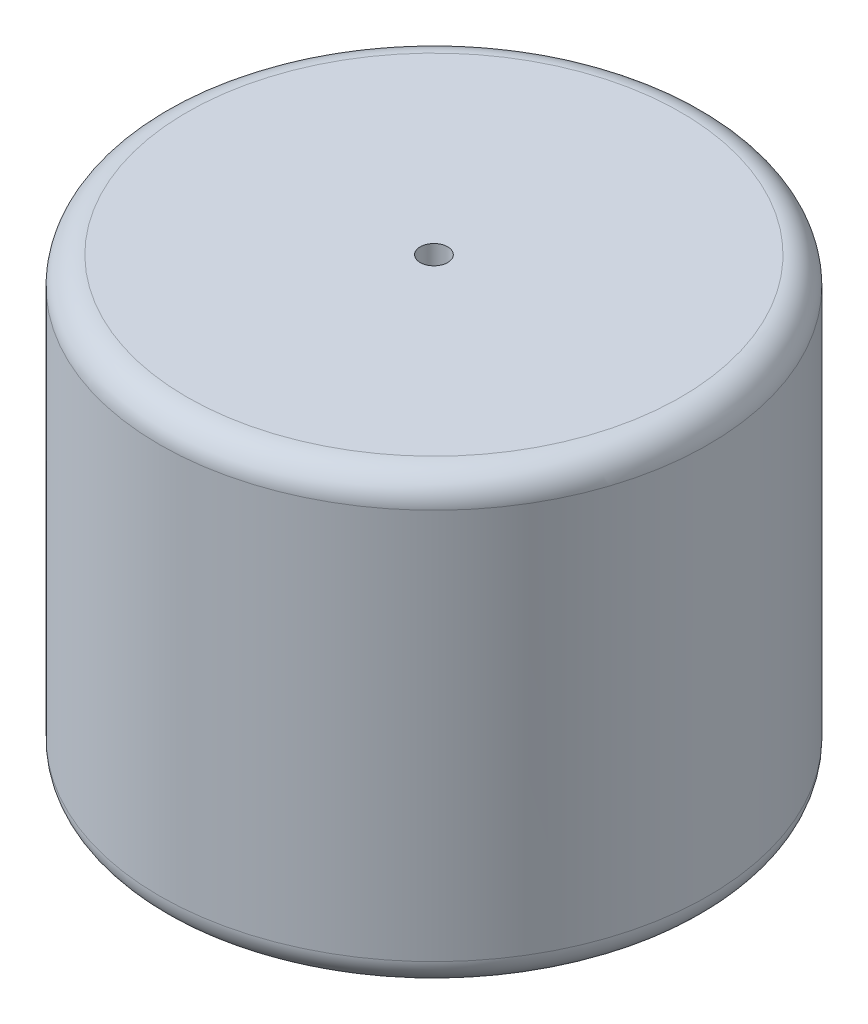
ISO-10303-21;
HEADER;
FILE_DESCRIPTION(('STEP AP214'),'2;1');
FILE_NAME('part.step','',(''),(''),'','','');
FILE_SCHEMA(('AUTOMOTIVE_DESIGN { 1 0 10303 214 1 1 1 1 }'));
ENDSEC;
DATA;
#1=APPLICATION_CONTEXT('core data for automotive mechanical design processes');
#2=APPLICATION_PROTOCOL_DEFINITION('international standard','automotive_design',2000,#1);
#3=PRODUCT_CONTEXT('',#1,'mechanical');
#4=PRODUCT('Part','Part','',(#3));
#5=PRODUCT_RELATED_PRODUCT_CATEGORY('part','',(#4));
#6=PRODUCT_DEFINITION_FORMATION('','',#4);
#7=PRODUCT_DEFINITION_CONTEXT('part definition',#1,'design');
#8=PRODUCT_DEFINITION('design','',#6,#7);
#9=PRODUCT_DEFINITION_SHAPE('','',#8);
#10=(LENGTH_UNIT() NAMED_UNIT(*) SI_UNIT(.MILLI.,.METRE.));
#11=(NAMED_UNIT(*) PLANE_ANGLE_UNIT() SI_UNIT($,.RADIAN.));
#12=(NAMED_UNIT(*) SI_UNIT($,.STERADIAN.) SOLID_ANGLE_UNIT());
#13=UNCERTAINTY_MEASURE_WITH_UNIT(LENGTH_MEASURE(1.E-05),#10,'distance_accuracy_value','');
#14=(GEOMETRIC_REPRESENTATION_CONTEXT(3) GLOBAL_UNCERTAINTY_ASSIGNED_CONTEXT((#13)) GLOBAL_UNIT_ASSIGNED_CONTEXT((#10,
#11,#12)) REPRESENTATION_CONTEXT('',''));
#15=CARTESIAN_POINT('',(0.,0.,0.));
#16=DIRECTION('',(0.,0.,1.));
#17=DIRECTION('',(1.,0.,0.));
#18=AXIS2_PLACEMENT_3D('',#15,#16,#17);
#19=CARTESIAN_POINT('',(0.,-7.5,0.));
#20=DIRECTION('',(0.,1.,0.));
#21=DIRECTION('',(0.,0.,1.));
#22=AXIS2_PLACEMENT_3D('',#19,#20,#21);
#23=PLANE('',#22);
#24=CARTESIAN_POINT('',(0.,-7.5,0.));
#25=DIRECTION('',(0.,1.,0.));
#26=DIRECTION('',(0.,0.,1.));
#27=AXIS2_PLACEMENT_3D('',#24,#25,#26);
#28=CIRCLE('',#27,3.6);
#29=CARTESIAN_POINT('',(0.,-7.5,3.6));
#30=VERTEX_POINT('',#29);
#31=EDGE_CURVE('E209',#30,#30,#28,.T.);
#32=ORIENTED_EDGE('',*,*,#31,.T.);
#33=EDGE_LOOP('',(#32));
#34=FACE_BOUND('',#33,.T.);
#35=CARTESIAN_POINT('',(0.,-7.5,0.));
#36=DIRECTION('',(0.,-1.,0.));
#37=DIRECTION('',(0.,0.,-1.));
#38=AXIS2_PLACEMENT_3D('',#35,#36,#37);
#39=CIRCLE('',#38,12.5);
#40=CARTESIAN_POINT('',(0.,-7.5,-12.5));
#41=VERTEX_POINT('',#40);
#42=CARTESIAN_POINT('',(0.,-7.5,12.5));
#43=VERTEX_POINT('',#42);
#44=EDGE_CURVE('E187',#41,#43,#39,.T.);
#45=ORIENTED_EDGE('',*,*,#44,.T.);
#46=DIRECTION('',(1.,0.,0.));
#47=VECTOR('',#46,1.);
#48=CARTESIAN_POINT('',(-20.,-7.5,12.5));
#49=LINE('',#48,#47);
#50=CARTESIAN_POINT('',(-15.612494995996,-7.5,12.5));
#51=VERTEX_POINT('',#50);
#52=EDGE_CURVE('E315',#51,#43,#49,.T.);
#53=ORIENTED_EDGE('',*,*,#52,.F.);
#54=CARTESIAN_POINT('',(0.,-7.5,0.));
#55=DIRECTION('',(0.,1.,0.));
#56=DIRECTION('',(0.,0.,1.));
#57=AXIS2_PLACEMENT_3D('',#54,#55,#56);
#58=CIRCLE('',#57,20.);
#59=CARTESIAN_POINT('',(-15.612494995996,-7.5,-12.5));
#60=VERTEX_POINT('',#59);
#61=EDGE_CURVE('E359',#51,#60,#58,.F.);
#62=ORIENTED_EDGE('',*,*,#61,.T.);
#63=DIRECTION('',(1.,0.,0.));
#64=VECTOR('',#63,1.);
#65=CARTESIAN_POINT('',(-20.,-7.5,-12.5));
#66=LINE('',#65,#64);
#67=EDGE_CURVE('E318',#60,#41,#66,.T.);
#68=ORIENTED_EDGE('',*,*,#67,.T.);
#69=EDGE_LOOP('',(#45,#53,#62,#68));
#70=FACE_BOUND('',#69,.T.);
#71=ADVANCED_FACE('F38',(#34,#70),#23,.F.);
#72=CARTESIAN_POINT('',(0.,-22.5,0.));
#73=DIRECTION('',(0.,1.,0.));
#74=DIRECTION('',(0.,0.,1.));
#75=AXIS2_PLACEMENT_3D('',#72,#73,#74);
#76=CYLINDRICAL_SURFACE('',#75,12.5);
#77=DIRECTION('',(0.,1.,0.));
#78=VECTOR('',#77,1.);
#79=CARTESIAN_POINT('',(-10.,-22.5,-7.5));
#80=LINE('',#79,#78);
#81=CARTESIAN_POINT('',(-10.,-22.5,-7.5));
#82=VERTEX_POINT('',#81);
#83=CARTESIAN_POINT('',(-10.,-17.5,-7.5));
#84=VERTEX_POINT('',#83);
#85=EDGE_CURVE('E347',#82,#84,#80,.T.);
#86=ORIENTED_EDGE('',*,*,#85,.F.);
#87=CARTESIAN_POINT('',(0.,-22.5,0.));
#88=DIRECTION('',(0.,-1.,0.));
#89=DIRECTION('',(0.,0.,-1.));
#90=AXIS2_PLACEMENT_3D('',#87,#88,#89);
#91=CIRCLE('',#90,12.5);
#92=CARTESIAN_POINT('',(-10.,-22.5,7.5));
#93=VERTEX_POINT('',#92);
#94=EDGE_CURVE('E194',#82,#93,#91,.T.);
#95=ORIENTED_EDGE('',*,*,#94,.T.);
#96=DIRECTION('',(0.,1.,0.));
#97=VECTOR('',#96,1.);
#98=CARTESIAN_POINT('',(-10.,-22.5,7.5));
#99=LINE('',#98,#97);
#100=CARTESIAN_POINT('',(-10.,-17.5,7.5));
#101=VERTEX_POINT('',#100);
#102=EDGE_CURVE('E334',#101,#93,#99,.F.);
#103=ORIENTED_EDGE('',*,*,#102,.F.);
#104=CARTESIAN_POINT('',(0.,-17.5,0.));
#105=DIRECTION('',(0.,-1.,0.));
#106=DIRECTION('',(0.,0.,-1.));
#107=AXIS2_PLACEMENT_3D('',#104,#105,#106);
#108=CIRCLE('',#107,12.5);
#109=CARTESIAN_POINT('',(0.,-17.5,12.5));
#110=VERTEX_POINT('',#109);
#111=EDGE_CURVE('E191',#110,#101,#108,.T.);
#112=ORIENTED_EDGE('',*,*,#111,.F.);
#113=DIRECTION('',(0.,-1.,0.));
#114=VECTOR('',#113,1.);
#115=CARTESIAN_POINT('',(0.,-7.5,12.5));
#116=LINE('',#115,#114);
#117=EDGE_CURVE('E297',#43,#110,#116,.T.);
#118=ORIENTED_EDGE('',*,*,#117,.F.);
#119=ORIENTED_EDGE('',*,*,#44,.F.);
#120=DIRECTION('',(0.,1.,0.));
#121=VECTOR('',#120,1.);
#122=CARTESIAN_POINT('',(0.,-7.5,-12.5));
#123=LINE('',#122,#121);
#124=CARTESIAN_POINT('',(0.,-17.5,-12.5));
#125=VERTEX_POINT('',#124);
#126=EDGE_CURVE('E293',#125,#41,#123,.T.);
#127=ORIENTED_EDGE('',*,*,#126,.F.);
#128=CARTESIAN_POINT('',(0.,-17.5,0.));
#129=DIRECTION('',(0.,-1.,0.));
#130=DIRECTION('',(0.,0.,-1.));
#131=AXIS2_PLACEMENT_3D('',#128,#129,#130);
#132=CIRCLE('',#131,12.5);
#133=EDGE_CURVE('E200',#84,#125,#132,.T.);
#134=ORIENTED_EDGE('',*,*,#133,.F.);
#135=EDGE_LOOP('',(#86,#95,#103,#112,#118,#119,#127,#134));
#136=FACE_BOUND('',#135,.T.);
#137=ADVANCED_FACE('F420',(#136),#76,.F.);
#138=CARTESIAN_POINT('',(0.,-22.5,0.));
#139=DIRECTION('',(0.,-1.,0.));
#140=DIRECTION('',(0.,0.,-1.));
#141=AXIS2_PLACEMENT_3D('',#138,#139,#140);
#142=PLANE('',#141);
#143=ORIENTED_EDGE('',*,*,#94,.F.);
#144=DIRECTION('',(1.,0.,0.));
#145=VECTOR('',#144,1.);
#146=CARTESIAN_POINT('',(0.,-22.5,-7.5));
#147=LINE('',#146,#145);
#148=CARTESIAN_POINT('',(-6.88856760882264,-22.5,-7.5));
#149=VERTEX_POINT('',#148);
#150=EDGE_CURVE('E343',#82,#149,#147,.T.);
#151=ORIENTED_EDGE('',*,*,#150,.T.);
#152=DIRECTION('',(0.851038037822176,0.,-0.525104045099427));
#153=VECTOR('',#152,1.);
#154=CARTESIAN_POINT('',(-10.1645108532667,-22.5,-5.47869076031458));
#155=LINE('',#154,#153);
#156=CARTESIAN_POINT('',(-0.337570048721829,-22.5,-11.5420699961289));
#157=VERTEX_POINT('',#156);
#158=EDGE_CURVE('E368',#149,#157,#155,.T.);
#159=ORIENTED_EDGE('',*,*,#158,.T.);
#160=DIRECTION('',(0.880272461597161,0.,0.474468537791152));
#161=VECTOR('',#160,1.);
#162=CARTESIAN_POINT('',(-0.337570048721829,-22.5,-11.5420699961289));
#163=LINE('',#162,#161);
#164=CARTESIAN_POINT('',(9.82694080454485,-22.5,-6.0633792358143));
#165=VERTEX_POINT('',#164);
#166=EDGE_CURVE('E388',#157,#165,#163,.T.);
#167=ORIENTED_EDGE('',*,*,#166,.T.);
#168=DIRECTION('',(0.0292344237749851,0.,0.99957258289058));
#169=VECTOR('',#168,1.);
#170=CARTESIAN_POINT('',(9.82694080454485,-22.5,-6.0633792358143));
#171=LINE('',#170,#169);
#172=CARTESIAN_POINT('',(10.1645108532667,-22.5,5.47869076031458));
#173=VERTEX_POINT('',#172);
#174=EDGE_CURVE('E392',#165,#173,#171,.T.);
#175=ORIENTED_EDGE('',*,*,#174,.T.);
#176=DIRECTION('',(-0.851038037822176,0.,0.525104045099427));
#177=VECTOR('',#176,1.);
#178=CARTESIAN_POINT('',(10.1645108532667,-22.5,5.47869076031458));
#179=LINE('',#178,#177);
#180=CARTESIAN_POINT('',(0.337570048721818,-22.5,11.5420699961289));
#181=VERTEX_POINT('',#180);
#182=EDGE_CURVE('E396',#173,#181,#179,.T.);
#183=ORIENTED_EDGE('',*,*,#182,.T.);
#184=DIRECTION('',(-0.880272461597161,0.,-0.474468537791153));
#185=VECTOR('',#184,1.);
#186=CARTESIAN_POINT('',(0.337570048721818,-22.5,11.5420699961289));
#187=LINE('',#186,#185);
#188=CARTESIAN_POINT('',(-7.16160560158564,-22.5,7.5));
#189=VERTEX_POINT('',#188);
#190=EDGE_CURVE('E373',#181,#189,#187,.T.);
#191=ORIENTED_EDGE('',*,*,#190,.T.);
#192=DIRECTION('',(-1.,0.,0.));
#193=VECTOR('',#192,1.);
#194=CARTESIAN_POINT('',(0.,-22.5,7.5));
#195=LINE('',#194,#193);
#196=EDGE_CURVE('E330',#189,#93,#195,.T.);
#197=ORIENTED_EDGE('',*,*,#196,.T.);
#198=EDGE_LOOP('',(#143,#151,#159,#167,#175,#183,#191,#197));
#199=FACE_BOUND('',#198,.T.);
#200=ADVANCED_FACE('F424',(#199),#142,.F.);
#201=CARTESIAN_POINT('',(-10.1645108532667,-27.5,-5.47869076031458));
#202=DIRECTION('',(0.525104045099427,0.,0.851038037822176));
#203=DIRECTION('',(0.851038037822176,0.,-0.525104045099427));
#204=AXIS2_PLACEMENT_3D('',#201,#202,#203);
#205=PLANE('',#204);
#206=DIRECTION('',(0.,1.,0.));
#207=VECTOR('',#206,1.);
#208=CARTESIAN_POINT('',(-6.88856760882264,-27.5,-7.5));
#209=LINE('',#208,#207);
#210=CARTESIAN_POINT('',(-6.88856760882264,-27.5,-7.5));
#211=VERTEX_POINT('',#210);
#212=EDGE_CURVE('E340',#211,#149,#209,.T.);
#213=ORIENTED_EDGE('',*,*,#212,.F.);
#214=DIRECTION('',(0.851038037822176,0.,-0.525104045099427));
#215=VECTOR('',#214,1.);
#216=CARTESIAN_POINT('',(-10.1645108532667,-27.5,-5.47869076031458));
#217=LINE('',#216,#215);
#218=CARTESIAN_POINT('',(-0.337570048721829,-27.5,-11.5420699961289));
#219=VERTEX_POINT('',#218);
#220=EDGE_CURVE('E369',#211,#219,#217,.T.);
#221=ORIENTED_EDGE('',*,*,#220,.T.);
#222=DIRECTION('',(0.,1.,0.));
#223=VECTOR('',#222,1.);
#224=CARTESIAN_POINT('',(-0.337570048721829,-27.5,-11.5420699961289));
#225=LINE('',#224,#223);
#226=EDGE_CURVE('E411',#219,#157,#225,.T.);
#227=ORIENTED_EDGE('',*,*,#226,.T.);
#228=ORIENTED_EDGE('',*,*,#158,.F.);
#229=EDGE_LOOP('',(#213,#221,#227,#228));
#230=FACE_BOUND('',#229,.T.);
#231=ADVANCED_FACE('F447',(#230),#205,.T.);
#232=CARTESIAN_POINT('',(-0.337570048721829,-27.5,-11.5420699961289));
#233=DIRECTION('',(-0.474468537791152,0.,0.880272461597161));
#234=DIRECTION('',(0.880272461597161,0.,0.474468537791152));
#235=AXIS2_PLACEMENT_3D('',#232,#233,#234);
#236=PLANE('',#235);
#237=ORIENTED_EDGE('',*,*,#166,.F.);
#238=ORIENTED_EDGE('',*,*,#226,.F.);
#239=DIRECTION('',(0.880272461597161,0.,0.474468537791152));
#240=VECTOR('',#239,1.);
#241=CARTESIAN_POINT('',(-0.337570048721829,-27.5,-11.5420699961289));
#242=LINE('',#241,#240);
#243=CARTESIAN_POINT('',(9.82694080454485,-27.5,-6.0633792358143));
#244=VERTEX_POINT('',#243);
#245=EDGE_CURVE('E372',#219,#244,#242,.T.);
#246=ORIENTED_EDGE('',*,*,#245,.T.);
#247=DIRECTION('',(0.,1.,0.));
#248=VECTOR('',#247,1.);
#249=CARTESIAN_POINT('',(9.82694080454485,-27.5,-6.0633792358143));
#250=LINE('',#249,#248);
#251=EDGE_CURVE('E408',#244,#165,#250,.T.);
#252=ORIENTED_EDGE('',*,*,#251,.T.);
#253=EDGE_LOOP('',(#237,#238,#246,#252));
#254=FACE_BOUND('',#253,.T.);
#255=ADVANCED_FACE('F443',(#254),#236,.T.);
#256=CARTESIAN_POINT('',(9.82694080454485,-27.5,-6.0633792358143));
#257=DIRECTION('',(-0.99957258289058,0.,0.0292344237749851));
#258=DIRECTION('',(0.0292344237749851,0.,0.99957258289058));
#259=AXIS2_PLACEMENT_3D('',#256,#257,#258);
#260=PLANE('',#259);
#261=ORIENTED_EDGE('',*,*,#174,.F.);
#262=ORIENTED_EDGE('',*,*,#251,.F.);
#263=DIRECTION('',(0.0292344237749851,0.,0.99957258289058));
#264=VECTOR('',#263,1.);
#265=CARTESIAN_POINT('',(9.82694080454485,-27.5,-6.0633792358143));
#266=LINE('',#265,#264);
#267=CARTESIAN_POINT('',(10.1645108532667,-27.5,5.47869076031458));
#268=VERTEX_POINT('',#267);
#269=EDGE_CURVE('E376',#244,#268,#266,.T.);
#270=ORIENTED_EDGE('',*,*,#269,.T.);
#271=DIRECTION('',(0.,1.,0.));
#272=VECTOR('',#271,1.);
#273=CARTESIAN_POINT('',(10.1645108532667,-27.5,5.47869076031458));
#274=LINE('',#273,#272);
#275=EDGE_CURVE('E405',#268,#173,#274,.T.);
#276=ORIENTED_EDGE('',*,*,#275,.T.);
#277=EDGE_LOOP('',(#261,#262,#270,#276));
#278=FACE_BOUND('',#277,.T.);
#279=ADVANCED_FACE('F439',(#278),#260,.T.);
#280=CARTESIAN_POINT('',(10.1645108532667,-27.5,5.47869076031458));
#281=DIRECTION('',(-0.525104045099427,0.,-0.851038037822176));
#282=DIRECTION('',(-0.851038037822176,0.,0.525104045099427));
#283=AXIS2_PLACEMENT_3D('',#280,#281,#282);
#284=PLANE('',#283);
#285=ORIENTED_EDGE('',*,*,#182,.F.);
#286=ORIENTED_EDGE('',*,*,#275,.F.);
#287=DIRECTION('',(-0.851038037822176,0.,0.525104045099427));
#288=VECTOR('',#287,1.);
#289=CARTESIAN_POINT('',(10.1645108532667,-27.5,5.47869076031458));
#290=LINE('',#289,#288);
#291=CARTESIAN_POINT('',(0.337570048721818,-27.5,11.5420699961289));
#292=VERTEX_POINT('',#291);
#293=EDGE_CURVE('E379',#268,#292,#290,.T.);
#294=ORIENTED_EDGE('',*,*,#293,.T.);
#295=DIRECTION('',(0.,1.,0.));
#296=VECTOR('',#295,1.);
#297=CARTESIAN_POINT('',(0.337570048721818,-27.5,11.5420699961289));
#298=LINE('',#297,#296);
#299=EDGE_CURVE('E385',#292,#181,#298,.T.);
#300=ORIENTED_EDGE('',*,*,#299,.T.);
#301=EDGE_LOOP('',(#285,#286,#294,#300));
#302=FACE_BOUND('',#301,.T.);
#303=ADVANCED_FACE('F436',(#302),#284,.T.);
#304=CARTESIAN_POINT('',(0.337570048721818,-27.5,11.5420699961289));
#305=DIRECTION('',(0.474468537791153,0.,-0.880272461597161));
#306=DIRECTION('',(-0.880272461597161,0.,-0.474468537791153));
#307=AXIS2_PLACEMENT_3D('',#304,#305,#306);
#308=PLANE('',#307);
#309=DIRECTION('',(0.,-1.,0.));
#310=VECTOR('',#309,1.);
#311=CARTESIAN_POINT('',(-7.16160560158564,-27.5,7.5));
#312=LINE('',#311,#310);
#313=CARTESIAN_POINT('',(-7.16160560158564,-27.5,7.5));
#314=VERTEX_POINT('',#313);
#315=EDGE_CURVE('E184',#189,#314,#312,.T.);
#316=ORIENTED_EDGE('',*,*,#315,.F.);
#317=ORIENTED_EDGE('',*,*,#190,.F.);
#318=ORIENTED_EDGE('',*,*,#299,.F.);
#319=DIRECTION('',(-0.880272461597161,0.,-0.474468537791153));
#320=VECTOR('',#319,1.);
#321=CARTESIAN_POINT('',(0.337570048721818,-27.5,11.5420699961289));
#322=LINE('',#321,#320);
#323=EDGE_CURVE('E382',#292,#314,#322,.T.);
#324=ORIENTED_EDGE('',*,*,#323,.T.);
#325=EDGE_LOOP('',(#316,#317,#318,#324));
#326=FACE_BOUND('',#325,.T.);
#327=ADVANCED_FACE('F428',(#326),#308,.T.);
#328=CARTESIAN_POINT('',(0.,-27.5,0.));
#329=DIRECTION('',(0.,-1.,0.));
#330=DIRECTION('',(0.,0.,-1.));
#331=AXIS2_PLACEMENT_3D('',#328,#329,#330);
#332=PLANE('',#331);
#333=DIRECTION('',(1.,0.,0.));
#334=VECTOR('',#333,1.);
#335=CARTESIAN_POINT('',(0.,-27.5,-7.5));
#336=LINE('',#335,#334);
#337=CARTESIAN_POINT('',(-2.78388218141501,-27.5,-7.5));
#338=VERTEX_POINT('',#337);
#339=EDGE_CURVE('E178',#211,#338,#336,.T.);
#340=ORIENTED_EDGE('',*,*,#339,.T.);
#341=CARTESIAN_POINT('',(0.,-27.5,0.));
#342=DIRECTION('',(0.,-1.,0.));
#343=DIRECTION('',(0.,0.,-1.));
#344=AXIS2_PLACEMENT_3D('',#341,#342,#343);
#345=CIRCLE('',#344,8.);
#346=CARTESIAN_POINT('',(-2.78388218141501,-27.5,7.5));
#347=VERTEX_POINT('',#346);
#348=EDGE_CURVE('E163',#338,#347,#345,.T.);
#349=ORIENTED_EDGE('',*,*,#348,.T.);
#350=DIRECTION('',(-1.,0.,0.));
#351=VECTOR('',#350,1.);
#352=CARTESIAN_POINT('',(0.,-27.5,7.5));
#353=LINE('',#352,#351);
#354=EDGE_CURVE('E175',#347,#314,#353,.T.);
#355=ORIENTED_EDGE('',*,*,#354,.T.);
#356=ORIENTED_EDGE('',*,*,#323,.F.);
#357=ORIENTED_EDGE('',*,*,#293,.F.);
#358=ORIENTED_EDGE('',*,*,#269,.F.);
#359=ORIENTED_EDGE('',*,*,#245,.F.);
#360=ORIENTED_EDGE('',*,*,#220,.F.);
#361=EDGE_LOOP('',(#340,#349,#355,#356,#357,#358,#359,#360));
#362=FACE_BOUND('',#361,.T.);
#363=ADVANCED_FACE('F173',(#362),#332,.F.);
#364=CARTESIAN_POINT('',(-20.,-17.5,-7.5));
#365=DIRECTION('',(0.,0.,-1.));
#366=DIRECTION('',(0.,1.,0.));
#367=AXIS2_PLACEMENT_3D('',#364,#365,#366);
#368=PLANE('',#367);
#369=DIRECTION('',(0.,1.,0.));
#370=VECTOR('',#369,1.);
#371=CARTESIAN_POINT('',(-18.5404962177392,-7.5,-7.5));
#372=LINE('',#371,#370);
#373=CARTESIAN_POINT('',(-18.5404962177392,-17.5,-7.5));
#374=VERTEX_POINT('',#373);
#375=CARTESIAN_POINT('',(-18.5404962177392,-30.5,-7.5));
#376=VERTEX_POINT('',#375);
#377=EDGE_CURVE('E350',#374,#376,#372,.F.);
#378=ORIENTED_EDGE('',*,*,#377,.T.);
#379=CARTESIAN_POINT('',(-18.5404962177392,-30.5,-7.5));
#380=CARTESIAN_POINT('',(-18.5405038626031,-30.5532033815394,-7.5));
#381=CARTESIAN_POINT('',(-18.5382062899093,-30.6064030749533,-7.5));
#382=CARTESIAN_POINT('',(-18.5290594191955,-30.7124002533729,-7.5));
#383=CARTESIAN_POINT('',(-18.5222109541686,-30.765197810197,-7.5));
#384=CARTESIAN_POINT('',(-18.5040445841791,-30.8698795557299,-7.5));
#385=CARTESIAN_POINT('',(-18.4927383303688,-30.9217657600593,-7.5));
#386=CARTESIAN_POINT('',(-18.4657800099643,-31.0243822853611,-7.5));
#387=CARTESIAN_POINT('',(-18.4501278849009,-31.0751125907722,-7.5));
#388=CARTESIAN_POINT('',(-18.3968637152594,-31.2250207531402,-7.5));
#389=CARTESIAN_POINT('',(-18.3529238401884,-31.3220297027154,-7.5));
#390=CARTESIAN_POINT('',(-18.2498262865808,-31.5075318060012,-7.5));
#391=CARTESIAN_POINT('',(-18.1906632516251,-31.5960219471949,-7.5));
#392=CARTESIAN_POINT('',(-18.0572594036222,-31.7648627064697,-7.5));
#393=CARTESIAN_POINT('',(-17.982643309874,-31.844916612645,-7.5));
#394=CARTESIAN_POINT('',(-17.8218161045351,-31.9923361614092,-7.5));
#395=CARTESIAN_POINT('',(-17.7356027831318,-32.0596993799438,-7.5));
#396=CARTESIAN_POINT('',(-17.5477319200209,-32.1848356311333,-7.5));
#397=CARTESIAN_POINT('',(-17.4454185604614,-32.2416228625109,-7.5));
#398=CARTESIAN_POINT('',(-17.2331902884244,-32.3386721299037,-7.5));
#399=CARTESIAN_POINT('',(-17.1232704175491,-32.3789232658105,-7.5));
#400=CARTESIAN_POINT('',(-16.9056514897865,-32.4405081333065,-7.5));
#401=CARTESIAN_POINT('',(-16.7982372921944,-32.4628600402973,-7.5));
#402=CARTESIAN_POINT('',(-16.5815594543872,-32.492604741488,-7.5));
#403=CARTESIAN_POINT('',(-16.4722997166053,-32.500025882101,-7.5));
#404=CARTESIAN_POINT('',(-16.3630681719536,-32.5,-7.5));
#405=B_SPLINE_CURVE_WITH_KNOTS('',3,(#379,#380,#381,#382,#383,#384,#385,#386,#387,#388,#389,
#390,#391,#392,#393,#394,#395,#396,#397,#398,#399,#400,#401,#402,#403,#404),.UNSPECIFIED.,.F.,
.F.,(4,2,2,2,2,2,2,2,2,2,2,2,4),(0.,0.159554216820927,0.319079236957612,0.4781900475346,
0.637302998885061,0.955186498600175,1.27318200207678,1.60006750923197,1.92701539178053,
2.27658084504947,2.62637635330519,2.95448399498324,3.28196812649634),.UNSPECIFIED.);
#406=CARTESIAN_POINT('',(-16.3630681719536,-32.5,-7.5));
#407=VERTEX_POINT('',#406);
#408=EDGE_CURVE('E47',#376,#407,#405,.T.);
#409=ORIENTED_EDGE('',*,*,#408,.T.);
#410=DIRECTION('',(1.,0.,0.));
#411=VECTOR('',#410,1.);
#412=CARTESIAN_POINT('',(-20.,-32.5,-7.5));
#413=LINE('',#412,#411);
#414=CARTESIAN_POINT('',(-2.78388218141501,-32.5,-7.5));
#415=VERTEX_POINT('',#414);
#416=EDGE_CURVE('E302',#407,#415,#413,.T.);
#417=ORIENTED_EDGE('',*,*,#416,.T.);
#418=DIRECTION('',(0.,-1.,0.));
#419=VECTOR('',#418,1.);
#420=CARTESIAN_POINT('',(-2.78388218141501,-27.5,-7.5));
#421=LINE('',#420,#419);
#422=EDGE_CURVE('E169',#415,#338,#421,.F.);
#423=ORIENTED_EDGE('',*,*,#422,.T.);
#424=ORIENTED_EDGE('',*,*,#339,.F.);
#425=ORIENTED_EDGE('',*,*,#212,.T.);
#426=ORIENTED_EDGE('',*,*,#150,.F.);
#427=ORIENTED_EDGE('',*,*,#85,.T.);
#428=DIRECTION('',(1.,0.,0.));
#429=VECTOR('',#428,1.);
#430=CARTESIAN_POINT('',(-20.,-17.5,-7.5));
#431=LINE('',#430,#429);
#432=EDGE_CURVE('E301',#374,#84,#431,.T.);
#433=ORIENTED_EDGE('',*,*,#432,.F.);
#434=EDGE_LOOP('',(#378,#409,#417,#423,#424,#425,#426,#427,#433));
#435=FACE_BOUND('',#434,.T.);
#436=ADVANCED_FACE('F234',(#435),#368,.F.);
#437=CARTESIAN_POINT('',(-20.,-17.5,7.5));
#438=DIRECTION('',(0.,0.,1.));
#439=DIRECTION('',(0.,-1.,0.));
#440=AXIS2_PLACEMENT_3D('',#437,#438,#439);
#441=PLANE('',#440);
#442=DIRECTION('',(1.,0.,0.));
#443=VECTOR('',#442,1.);
#444=CARTESIAN_POINT('',(-20.,-32.5,7.5));
#445=LINE('',#444,#443);
#446=CARTESIAN_POINT('',(-16.3630681719536,-32.5,7.5));
#447=VERTEX_POINT('',#446);
#448=CARTESIAN_POINT('',(-2.78388218141501,-32.5,7.5));
#449=VERTEX_POINT('',#448);
#450=EDGE_CURVE('E305',#447,#449,#445,.T.);
#451=ORIENTED_EDGE('',*,*,#450,.F.);
#452=CARTESIAN_POINT('',(-16.3630681719536,-32.5,7.5));
#453=CARTESIAN_POINT('',(-16.4288754008229,-32.4999963949958,7.5));
#454=CARTESIAN_POINT('',(-16.4946545457639,-32.4973143470658,7.5));
#455=CARTESIAN_POINT('',(-16.6257855006812,-32.4865594722641,7.5));
#456=CARTESIAN_POINT('',(-16.69113720545,-32.4784853651739,7.5));
#457=CARTESIAN_POINT('',(-16.886173530302,-32.446088383969,7.5));
#458=CARTESIAN_POINT('',(-17.0146071625513,-32.4135905974866,7.5));
#459=CARTESIAN_POINT('',(-17.2642268543706,-32.3269791721589,7.5));
#460=CARTESIAN_POINT('',(-17.3853984013835,-32.2728238071757,7.5));
#461=CARTESIAN_POINT('',(-17.6160218435054,-32.1437371720026,7.5));
#462=CARTESIAN_POINT('',(-17.7254887606043,-32.0688329859135,7.5));
#463=CARTESIAN_POINT('',(-17.9224944792999,-31.9048571761228,7.5));
#464=CARTESIAN_POINT('',(-18.0109472443075,-31.8168853938527,7.5));
#465=CARTESIAN_POINT('',(-18.1702212795134,-31.6261139452869,7.5));
#466=CARTESIAN_POINT('',(-18.2410434316834,-31.5233150211257,7.5));
#467=CARTESIAN_POINT('',(-18.3567665676294,-31.3151335714382,7.5));
#468=CARTESIAN_POINT('',(-18.4033301664902,-31.2106723523987,7.5));
#469=CARTESIAN_POINT('',(-18.4768568063554,-30.9951542209158,7.5));
#470=CARTESIAN_POINT('',(-18.5038553660915,-30.8841096586352,7.5));
#471=CARTESIAN_POINT('',(-18.527157575402,-30.726681031927,7.5));
#472=CARTESIAN_POINT('',(-18.5321592585105,-30.6814536903017,7.5));
#473=CARTESIAN_POINT('',(-18.5388248967628,-30.5908254510262,7.5));
#474=CARTESIAN_POINT('',(-18.540494106514,-30.5454249398795,7.5));
#475=CARTESIAN_POINT('',(-18.5404962177393,-30.5,7.5));
#476=B_SPLINE_CURVE_WITH_KNOTS('',3,(#452,#453,#454,#455,#456,#457,#458,#459,#460,#461,#462,
#463,#464,#465,#466,#467,#468,#469,#470,#471,#472,#473,#474,#475),.UNSPECIFIED.,.F.,.F.,(4,2,2,
2,2,2,2,2,2,2,2,4),(0.,0.19730885905154,0.394664581148023,0.790064115684012,1.18622913732748,
1.58187944935475,1.95413102230699,2.32636396962367,2.66772648865879,3.00846772872223,
3.14487864519295,3.28107430000812),.UNSPECIFIED.);
#477=CARTESIAN_POINT('',(-18.5404962177392,-30.5,7.5));
#478=VERTEX_POINT('',#477);
#479=EDGE_CURVE('E62',#447,#478,#476,.T.);
#480=ORIENTED_EDGE('',*,*,#479,.T.);
#481=DIRECTION('',(0.,1.,0.));
#482=VECTOR('',#481,1.);
#483=CARTESIAN_POINT('',(-18.5404962177392,-7.5,7.5));
#484=LINE('',#483,#482);
#485=CARTESIAN_POINT('',(-18.5404962177392,-17.5,7.5));
#486=VERTEX_POINT('',#485);
#487=EDGE_CURVE('E337',#478,#486,#484,.T.);
#488=ORIENTED_EDGE('',*,*,#487,.T.);
#489=DIRECTION('',(1.,0.,0.));
#490=VECTOR('',#489,1.);
#491=CARTESIAN_POINT('',(-20.,-17.5,7.5));
#492=LINE('',#491,#490);
#493=EDGE_CURVE('E308',#486,#101,#492,.T.);
#494=ORIENTED_EDGE('',*,*,#493,.T.);
#495=ORIENTED_EDGE('',*,*,#102,.T.);
#496=ORIENTED_EDGE('',*,*,#196,.F.);
#497=ORIENTED_EDGE('',*,*,#315,.T.);
#498=ORIENTED_EDGE('',*,*,#354,.F.);
#499=DIRECTION('',(0.,-1.,0.));
#500=VECTOR('',#499,1.);
#501=CARTESIAN_POINT('',(-2.78388218141501,-27.5,7.5));
#502=LINE('',#501,#500);
#503=EDGE_CURVE('E159',#347,#449,#502,.T.);
#504=ORIENTED_EDGE('',*,*,#503,.T.);
#505=EDGE_LOOP('',(#451,#480,#488,#494,#495,#496,#497,#498,#504));
#506=FACE_BOUND('',#505,.T.);
#507=ADVANCED_FACE('F182',(#506),#441,.F.);
#508=CARTESIAN_POINT('',(-20.,-17.5,12.5));
#509=DIRECTION('',(0.,-1.,0.));
#510=DIRECTION('',(0.,0.,-1.));
#511=AXIS2_PLACEMENT_3D('',#508,#509,#510);
#512=PLANE('',#511);
#513=CARTESIAN_POINT('',(0.,-17.5,0.));
#514=DIRECTION('',(0.,-1.,0.));
#515=DIRECTION('',(0.,0.,-1.));
#516=AXIS2_PLACEMENT_3D('',#513,#514,#515);
#517=CIRCLE('',#516,20.);
#518=CARTESIAN_POINT('',(-15.612494995996,-17.5,12.5));
#519=VERTEX_POINT('',#518);
#520=EDGE_CURVE('E365',#486,#519,#517,.F.);
#521=ORIENTED_EDGE('',*,*,#520,.T.);
#522=DIRECTION('',(1.,0.,0.));
#523=VECTOR('',#522,1.);
#524=CARTESIAN_POINT('',(-20.,-17.5,12.5));
#525=LINE('',#524,#523);
#526=EDGE_CURVE('E312',#519,#110,#525,.T.);
#527=ORIENTED_EDGE('',*,*,#526,.T.);
#528=ORIENTED_EDGE('',*,*,#111,.T.);
#529=ORIENTED_EDGE('',*,*,#493,.F.);
#530=EDGE_LOOP('',(#521,#527,#528,#529));
#531=FACE_BOUND('',#530,.T.);
#532=ADVANCED_FACE('F233',(#531),#512,.F.);
#533=CARTESIAN_POINT('',(-20.,-7.5,12.5));
#534=DIRECTION('',(0.,0.,1.));
#535=DIRECTION('',(0.,-1.,0.));
#536=AXIS2_PLACEMENT_3D('',#533,#534,#535);
#537=PLANE('',#536);
#538=DIRECTION('',(0.,1.,0.));
#539=VECTOR('',#538,1.);
#540=CARTESIAN_POINT('',(-15.612494995996,-7.5,12.5));
#541=LINE('',#540,#539);
#542=EDGE_CURVE('E362',#519,#51,#541,.T.);
#543=ORIENTED_EDGE('',*,*,#542,.T.);
#544=ORIENTED_EDGE('',*,*,#52,.T.);
#545=ORIENTED_EDGE('',*,*,#117,.T.);
#546=ORIENTED_EDGE('',*,*,#526,.F.);
#547=EDGE_LOOP('',(#543,#544,#545,#546));
#548=FACE_BOUND('',#547,.T.);
#549=ADVANCED_FACE('F238',(#548),#537,.F.);
#550=CARTESIAN_POINT('',(-20.,-7.5,-12.5));
#551=DIRECTION('',(0.,0.,-1.));
#552=DIRECTION('',(-1.,0.,0.));
#553=AXIS2_PLACEMENT_3D('',#550,#551,#552);
#554=PLANE('',#553);
#555=DIRECTION('',(0.,1.,0.));
#556=VECTOR('',#555,1.);
#557=CARTESIAN_POINT('',(-15.612494995996,-7.5,-12.5));
#558=LINE('',#557,#556);
#559=CARTESIAN_POINT('',(-15.612494995996,-17.5,-12.5));
#560=VERTEX_POINT('',#559);
#561=EDGE_CURVE('E356',#60,#560,#558,.F.);
#562=ORIENTED_EDGE('',*,*,#561,.T.);
#563=DIRECTION('',(1.,0.,0.));
#564=VECTOR('',#563,1.);
#565=CARTESIAN_POINT('',(-20.,-17.5,-12.5));
#566=LINE('',#565,#564);
#567=EDGE_CURVE('E321',#560,#125,#566,.T.);
#568=ORIENTED_EDGE('',*,*,#567,.T.);
#569=ORIENTED_EDGE('',*,*,#126,.T.);
#570=ORIENTED_EDGE('',*,*,#67,.F.);
#571=EDGE_LOOP('',(#562,#568,#569,#570));
#572=FACE_BOUND('',#571,.T.);
#573=ADVANCED_FACE('F242',(#572),#554,.F.);
#574=CARTESIAN_POINT('',(-20.,-17.5,-7.5));
#575=DIRECTION('',(0.,-1.,0.));
#576=DIRECTION('',(0.,0.,-1.));
#577=AXIS2_PLACEMENT_3D('',#574,#575,#576);
#578=PLANE('',#577);
#579=CARTESIAN_POINT('',(0.,-17.5,0.));
#580=DIRECTION('',(0.,-1.,0.));
#581=DIRECTION('',(0.,0.,-1.));
#582=AXIS2_PLACEMENT_3D('',#579,#580,#581);
#583=CIRCLE('',#582,20.);
#584=EDGE_CURVE('E353',#560,#374,#583,.F.);
#585=ORIENTED_EDGE('',*,*,#584,.T.);
#586=ORIENTED_EDGE('',*,*,#432,.T.);
#587=ORIENTED_EDGE('',*,*,#133,.T.);
#588=ORIENTED_EDGE('',*,*,#567,.F.);
#589=EDGE_LOOP('',(#585,#586,#587,#588));
#590=FACE_BOUND('',#589,.T.);
#591=ADVANCED_FACE('F246',(#590),#578,.F.);
#592=CARTESIAN_POINT('',(0.,-7.5,0.));
#593=DIRECTION('',(0.,1.,0.));
#594=DIRECTION('',(0.,0.,1.));
#595=AXIS2_PLACEMENT_3D('',#592,#593,#594);
#596=CYLINDRICAL_SURFACE('',#595,20.);
#597=CARTESIAN_POINT('',(0.,-2.,0.));
#598=DIRECTION('',(0.,1.,0.));
#599=DIRECTION('',(0.,0.,1.));
#600=AXIS2_PLACEMENT_3D('',#597,#598,#599);
#601=CIRCLE('',#600,20.);
#602=CARTESIAN_POINT('',(0.,-2.,20.));
#603=VERTEX_POINT('',#602);
#604=EDGE_CURVE('E224',#603,#603,#601,.F.);
#605=ORIENTED_EDGE('',*,*,#604,.T.);
#606=EDGE_LOOP('',(#605));
#607=FACE_BOUND('',#606,.T.);
#608=ORIENTED_EDGE('',*,*,#487,.F.);
#609=CARTESIAN_POINT('',(0.,-30.5,0.));
#610=DIRECTION('',(0.,-1.,0.));
#611=DIRECTION('',(0.,0.,-1.));
#612=AXIS2_PLACEMENT_3D('',#609,#610,#611);
#613=CIRCLE('',#612,20.);
#614=EDGE_CURVE('E54',#478,#376,#613,.F.);
#615=ORIENTED_EDGE('',*,*,#614,.T.);
#616=ORIENTED_EDGE('',*,*,#377,.F.);
#617=ORIENTED_EDGE('',*,*,#584,.F.);
#618=ORIENTED_EDGE('',*,*,#561,.F.);
#619=ORIENTED_EDGE('',*,*,#61,.F.);
#620=ORIENTED_EDGE('',*,*,#542,.F.);
#621=ORIENTED_EDGE('',*,*,#520,.F.);
#622=EDGE_LOOP('',(#608,#615,#616,#617,#618,#619,#620,#621));
#623=FACE_BOUND('',#622,.T.);
#624=ADVANCED_FACE('F250',(#607,#623),#596,.T.);
#625=CARTESIAN_POINT('',(0.,0.,0.));
#626=DIRECTION('',(0.,1.,0.));
#627=DIRECTION('',(0.,0.,1.));
#628=AXIS2_PLACEMENT_3D('',#625,#626,#627);
#629=PLANE('',#628);
#630=CARTESIAN_POINT('',(0.,0.,0.));
#631=DIRECTION('',(0.,1.,0.));
#632=DIRECTION('',(0.,0.,1.));
#633=AXIS2_PLACEMENT_3D('',#630,#631,#632);
#634=CIRCLE('',#633,18.);
#635=CARTESIAN_POINT('',(0.,0.,18.));
#636=VERTEX_POINT('',#635);
#637=EDGE_CURVE('E11',#636,#636,#634,.T.);
#638=ORIENTED_EDGE('',*,*,#637,.T.);
#639=EDGE_LOOP('',(#638));
#640=FACE_BOUND('',#639,.T.);
#641=CARTESIAN_POINT('',(0.,0.,0.));
#642=DIRECTION('',(0.,-1.,0.));
#643=DIRECTION('',(0.,0.,-1.));
#644=AXIS2_PLACEMENT_3D('',#641,#642,#643);
#645=CIRCLE('',#644,1.);
#646=CARTESIAN_POINT('',(0.,0.,-1.));
#647=VERTEX_POINT('',#646);
#648=EDGE_CURVE('E279',#647,#647,#645,.T.);
#649=ORIENTED_EDGE('',*,*,#648,.T.);
#650=EDGE_LOOP('',(#649));
#651=FACE_BOUND('',#650,.T.);
#652=ADVANCED_FACE('F272',(#640,#651),#629,.T.);
#653=CARTESIAN_POINT('',(0.,-32.5,0.));
#654=DIRECTION('',(0.,-1.,0.));
#655=DIRECTION('',(0.,0.,-1.));
#656=AXIS2_PLACEMENT_3D('',#653,#654,#655);
#657=PLANE('',#656);
#658=ORIENTED_EDGE('',*,*,#416,.F.);
#659=CARTESIAN_POINT('',(0.,-32.5,0.));
#660=DIRECTION('',(0.,-1.,0.));
#661=DIRECTION('',(0.,0.,-1.));
#662=AXIS2_PLACEMENT_3D('',#659,#660,#661);
#663=CIRCLE('',#662,18.);
#664=EDGE_CURVE('E213',#407,#447,#663,.T.);
#665=ORIENTED_EDGE('',*,*,#664,.T.);
#666=ORIENTED_EDGE('',*,*,#450,.T.);
#667=CARTESIAN_POINT('',(0.,-32.5,0.));
#668=DIRECTION('',(0.,-1.,0.));
#669=DIRECTION('',(0.,0.,-1.));
#670=AXIS2_PLACEMENT_3D('',#667,#668,#669);
#671=CIRCLE('',#670,8.);
#672=EDGE_CURVE('E166',#415,#449,#671,.T.);
#673=ORIENTED_EDGE('',*,*,#672,.F.);
#674=EDGE_LOOP('',(#658,#665,#666,#673));
#675=FACE_BOUND('',#674,.T.);
#676=ADVANCED_FACE('F275',(#675),#657,.T.);
#677=CARTESIAN_POINT('',(0.,-27.5,0.));
#678=DIRECTION('',(0.,-1.,0.));
#679=DIRECTION('',(0.,0.,-1.));
#680=AXIS2_PLACEMENT_3D('',#677,#678,#679);
#681=CYLINDRICAL_SURFACE('',#680,8.);
#682=ORIENTED_EDGE('',*,*,#672,.T.);
#683=ORIENTED_EDGE('',*,*,#503,.F.);
#684=ORIENTED_EDGE('',*,*,#348,.F.);
#685=ORIENTED_EDGE('',*,*,#422,.F.);
#686=EDGE_LOOP('',(#682,#683,#684,#685));
#687=FACE_BOUND('',#686,.T.);
#688=ADVANCED_FACE('F161',(#687),#681,.F.);
#689=CARTESIAN_POINT('',(0.,-3.,0.));
#690=DIRECTION('',(0.,-1.,0.));
#691=DIRECTION('',(0.,0.,-1.));
#692=AXIS2_PLACEMENT_3D('',#689,#690,#691);
#693=CYLINDRICAL_SURFACE('',#692,2.1);
#694=CARTESIAN_POINT('',(0.,-6.,0.));
#695=DIRECTION('',(0.,1.,0.));
#696=DIRECTION('',(0.,0.,1.));
#697=AXIS2_PLACEMENT_3D('',#694,#695,#696);
#698=CIRCLE('',#697,2.1);
#699=CARTESIAN_POINT('',(0.,-6.,2.1));
#700=VERTEX_POINT('',#699);
#701=EDGE_CURVE('E205',#700,#700,#698,.F.);
#702=ORIENTED_EDGE('',*,*,#701,.T.);
#703=EDGE_LOOP('',(#702));
#704=FACE_BOUND('',#703,.T.);
#705=CARTESIAN_POINT('',(0.,-3.,0.));
#706=DIRECTION('',(0.,-1.,0.));
#707=DIRECTION('',(0.,0.,-1.));
#708=AXIS2_PLACEMENT_3D('',#705,#706,#707);
#709=CIRCLE('',#708,2.1);
#710=CARTESIAN_POINT('',(0.,-3.,-2.1));
#711=VERTEX_POINT('',#710);
#712=EDGE_CURVE('E180',#711,#711,#709,.T.);
#713=ORIENTED_EDGE('',*,*,#712,.F.);
#714=EDGE_LOOP('',(#713));
#715=FACE_BOUND('',#714,.T.);
#716=ADVANCED_FACE('F494',(#704,#715),#693,.F.);
#717=CARTESIAN_POINT('',(0.,-3.,0.));
#718=DIRECTION('',(0.,-1.,0.));
#719=DIRECTION('',(0.,0.,-1.));
#720=AXIS2_PLACEMENT_3D('',#717,#718,#719);
#721=PLANE('',#720);
#722=CARTESIAN_POINT('',(0.,-3.,0.));
#723=DIRECTION('',(0.,-1.,0.));
#724=DIRECTION('',(0.,0.,-1.));
#725=AXIS2_PLACEMENT_3D('',#722,#723,#724);
#726=CIRCLE('',#725,1.);
#727=CARTESIAN_POINT('',(0.,-3.,-1.));
#728=VERTEX_POINT('',#727);
#729=EDGE_CURVE('E282',#728,#728,#726,.T.);
#730=ORIENTED_EDGE('',*,*,#729,.F.);
#731=EDGE_LOOP('',(#730));
#732=FACE_BOUND('',#731,.T.);
#733=ORIENTED_EDGE('',*,*,#712,.T.);
#734=EDGE_LOOP('',(#733));
#735=FACE_BOUND('',#734,.T.);
#736=ADVANCED_FACE('F488',(#732,#735),#721,.T.);
#737=CARTESIAN_POINT('',(0.,0.,0.));
#738=DIRECTION('',(0.,-1.,0.));
#739=DIRECTION('',(0.,0.,-1.));
#740=AXIS2_PLACEMENT_3D('',#737,#738,#739);
#741=CYLINDRICAL_SURFACE('',#740,1.);
#742=ORIENTED_EDGE('',*,*,#648,.F.);
#743=EDGE_LOOP('',(#742));
#744=FACE_BOUND('',#743,.T.);
#745=ORIENTED_EDGE('',*,*,#729,.T.);
#746=EDGE_LOOP('',(#745));
#747=FACE_BOUND('',#746,.T.);
#748=ADVANCED_FACE('F482',(#744,#747),#741,.F.);
#749=CARTESIAN_POINT('',(0.,-6.,0.));
#750=DIRECTION('',(0.,1.,0.));
#751=DIRECTION('',(0.,0.,1.));
#752=AXIS2_PLACEMENT_3D('',#749,#750,#751);
#753=TOROIDAL_SURFACE('',#752,3.6,1.5);
#754=ORIENTED_EDGE('',*,*,#31,.F.);
#755=EDGE_LOOP('',(#754));
#756=FACE_BOUND('',#755,.T.);
#757=ORIENTED_EDGE('',*,*,#701,.F.);
#758=EDGE_LOOP('',(#757));
#759=FACE_BOUND('',#758,.T.);
#760=ADVANCED_FACE('F480',(#756,#759),#753,.T.);
#761=CARTESIAN_POINT('',(0.,-30.5,0.));
#762=DIRECTION('',(0.,-1.,0.));
#763=DIRECTION('',(0.,0.,-1.));
#764=AXIS2_PLACEMENT_3D('',#761,#762,#763);
#765=TOROIDAL_SURFACE('',#764,18.,2.);
#766=ORIENTED_EDGE('',*,*,#408,.F.);
#767=ORIENTED_EDGE('',*,*,#614,.F.);
#768=ORIENTED_EDGE('',*,*,#479,.F.);
#769=ORIENTED_EDGE('',*,*,#664,.F.);
#770=EDGE_LOOP('',(#766,#767,#768,#769));
#771=FACE_BOUND('',#770,.T.);
#772=ADVANCED_FACE('F226',(#771),#765,.T.);
#773=CARTESIAN_POINT('',(0.,-2.,0.));
#774=DIRECTION('',(0.,1.,0.));
#775=DIRECTION('',(0.,0.,1.));
#776=AXIS2_PLACEMENT_3D('',#773,#774,#775);
#777=TOROIDAL_SURFACE('',#776,18.,2.);
#778=ORIENTED_EDGE('',*,*,#604,.F.);
#779=EDGE_LOOP('',(#778));
#780=FACE_BOUND('',#779,.T.);
#781=ORIENTED_EDGE('',*,*,#637,.F.);
#782=EDGE_LOOP('',(#781));
#783=FACE_BOUND('',#782,.T.);
#784=ADVANCED_FACE('F40',(#780,#783),#777,.T.);
#785=CLOSED_SHELL('',(#71,#137,#200,#231,#255,#279,#303,#327,#363,#436,#507,#532,#549,#573,#591,
#624,#652,#676,#688,#716,#736,#748,#760,#772,#784));
#786=MANIFOLD_SOLID_BREP('B2',#785);
#787=ADVANCED_BREP_SHAPE_REPRESENTATION('',(#18,#786),#14);
#788=SHAPE_DEFINITION_REPRESENTATION(#9,#787);
ENDSEC;
END-ISO-10303-21;
